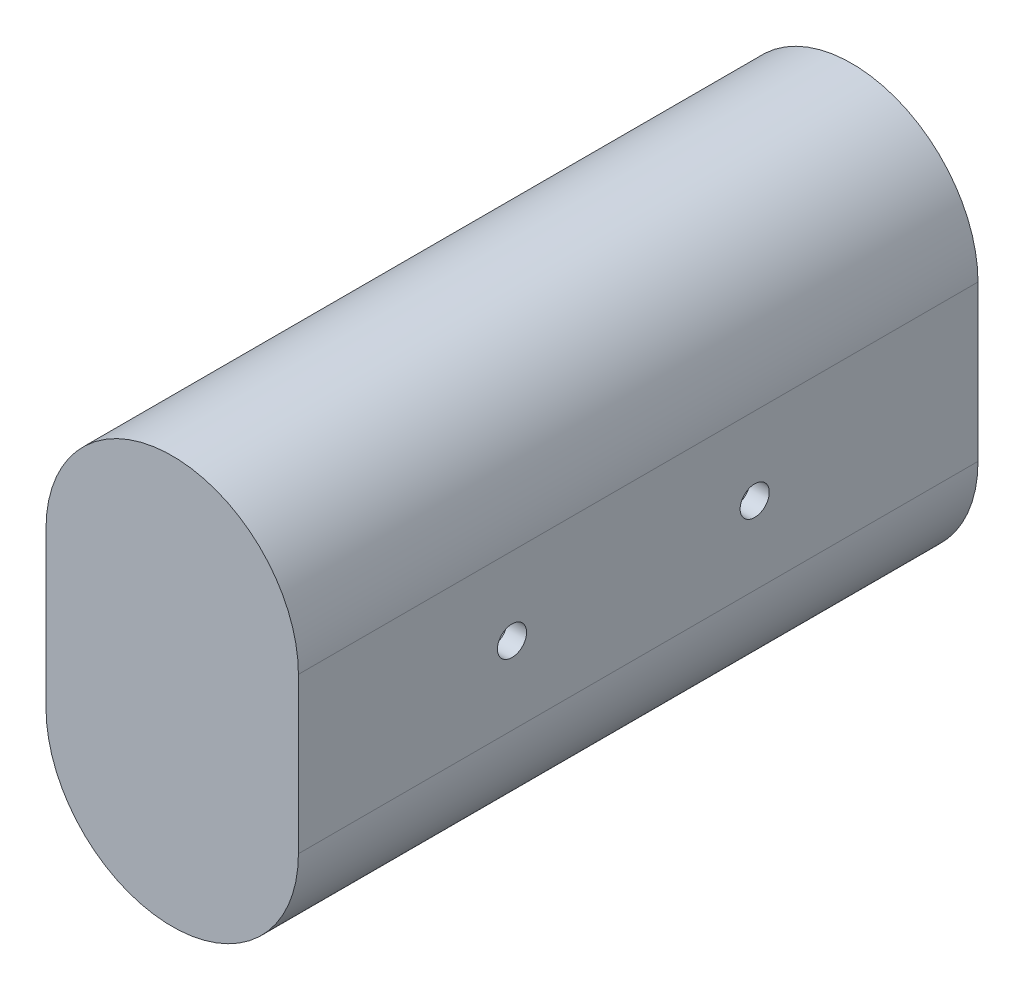
ISO-10303-21;
HEADER;
FILE_DESCRIPTION(('STEP AP214'),'2;1');
FILE_NAME('part.step','',(''),(''),'','','');
FILE_SCHEMA(('AUTOMOTIVE_DESIGN { 1 0 10303 214 1 1 1 1 }'));
ENDSEC;
DATA;
#1=APPLICATION_CONTEXT('core data for automotive mechanical design processes');
#2=APPLICATION_PROTOCOL_DEFINITION('international standard','automotive_design',2000,#1);
#3=PRODUCT_CONTEXT('',#1,'mechanical');
#4=PRODUCT('Part','Part','',(#3));
#5=PRODUCT_RELATED_PRODUCT_CATEGORY('part','',(#4));
#6=PRODUCT_DEFINITION_FORMATION('','',#4);
#7=PRODUCT_DEFINITION_CONTEXT('part definition',#1,'design');
#8=PRODUCT_DEFINITION('design','',#6,#7);
#9=PRODUCT_DEFINITION_SHAPE('','',#8);
#10=(LENGTH_UNIT() NAMED_UNIT(*) SI_UNIT(.MILLI.,.METRE.));
#11=(NAMED_UNIT(*) PLANE_ANGLE_UNIT() SI_UNIT($,.RADIAN.));
#12=(NAMED_UNIT(*) SI_UNIT($,.STERADIAN.) SOLID_ANGLE_UNIT());
#13=UNCERTAINTY_MEASURE_WITH_UNIT(LENGTH_MEASURE(1.E-05),#10,'distance_accuracy_value','');
#14=(GEOMETRIC_REPRESENTATION_CONTEXT(3) GLOBAL_UNCERTAINTY_ASSIGNED_CONTEXT((#13)) GLOBAL_UNIT_ASSIGNED_CONTEXT((#10,
#11,#12)) REPRESENTATION_CONTEXT('',''));
#15=CARTESIAN_POINT('',(0.,0.,0.));
#16=DIRECTION('',(0.,0.,1.));
#17=DIRECTION('',(1.,0.,0.));
#18=AXIS2_PLACEMENT_3D('',#15,#16,#17);
#19=CARTESIAN_POINT('',(13.,0.,70.));
#20=DIRECTION('',(0.,0.,-1.));
#21=DIRECTION('',(-1.,0.,0.));
#22=AXIS2_PLACEMENT_3D('',#19,#20,#21);
#23=CYLINDRICAL_SURFACE('',#22,11.);
#24=DIRECTION('',(0.,0.,-1.));
#25=VECTOR('',#24,1.);
#26=CARTESIAN_POINT('',(2.,0.,70.));
#27=LINE('',#26,#25);
#28=CARTESIAN_POINT('',(2.,0.,68.));
#29=VERTEX_POINT('',#28);
#30=CARTESIAN_POINT('',(2.,0.,0.));
#31=VERTEX_POINT('',#30);
#32=EDGE_CURVE('E145',#29,#31,#27,.T.);
#33=ORIENTED_EDGE('',*,*,#32,.F.);
#34=CARTESIAN_POINT('',(13.,0.,68.));
#35=DIRECTION('',(0.,0.,1.));
#36=DIRECTION('',(1.,0.,0.));
#37=AXIS2_PLACEMENT_3D('',#34,#35,#36);
#38=CIRCLE('',#37,11.);
#39=CARTESIAN_POINT('',(24.,0.,68.));
#40=VERTEX_POINT('',#39);
#41=EDGE_CURVE('E54',#29,#40,#38,.T.);
#42=ORIENTED_EDGE('',*,*,#41,.T.);
#43=DIRECTION('',(0.,0.,-1.));
#44=VECTOR('',#43,1.);
#45=CARTESIAN_POINT('',(24.,0.,70.));
#46=LINE('',#45,#44);
#47=CARTESIAN_POINT('',(24.,0.,0.));
#48=VERTEX_POINT('',#47);
#49=EDGE_CURVE('E147',#40,#48,#46,.T.);
#50=ORIENTED_EDGE('',*,*,#49,.T.);
#51=CARTESIAN_POINT('',(13.,0.,0.));
#52=DIRECTION('',(0.,0.,1.));
#53=DIRECTION('',(-1.,0.,0.));
#54=AXIS2_PLACEMENT_3D('',#51,#52,#53);
#55=CIRCLE('',#54,11.);
#56=EDGE_CURVE('E393',#31,#48,#55,.T.);
#57=ORIENTED_EDGE('',*,*,#56,.F.);
#58=EDGE_LOOP('',(#33,#42,#50,#57));
#59=FACE_BOUND('',#58,.T.);
#60=ADVANCED_FACE('F39',(#59),#23,.F.);
#61=CARTESIAN_POINT('',(24.,0.,70.));
#62=DIRECTION('',(-1.,0.,0.));
#63=DIRECTION('',(0.,0.,1.));
#64=AXIS2_PLACEMENT_3D('',#61,#62,#63);
#65=PLANE('',#64);
#66=CARTESIAN_POINT('',(24.,8.,23.));
#67=DIRECTION('',(-1.,0.,0.));
#68=DIRECTION('',(0.,0.,1.));
#69=AXIS2_PLACEMENT_3D('',#66,#67,#68);
#70=CIRCLE('',#69,1.5);
#71=CARTESIAN_POINT('',(24.,8.,24.5));
#72=VERTEX_POINT('',#71);
#73=EDGE_CURVE('E386',#72,#72,#70,.T.);
#74=ORIENTED_EDGE('',*,*,#73,.F.);
#75=EDGE_LOOP('',(#74));
#76=FACE_BOUND('',#75,.T.);
#77=CARTESIAN_POINT('',(24.,8.,48.));
#78=DIRECTION('',(-1.,0.,0.));
#79=DIRECTION('',(0.,0.,1.));
#80=AXIS2_PLACEMENT_3D('',#77,#78,#79);
#81=CIRCLE('',#80,1.5);
#82=CARTESIAN_POINT('',(24.,8.,49.5));
#83=VERTEX_POINT('',#82);
#84=EDGE_CURVE('E390',#83,#83,#81,.T.);
#85=ORIENTED_EDGE('',*,*,#84,.F.);
#86=EDGE_LOOP('',(#85));
#87=FACE_BOUND('',#86,.T.);
#88=ORIENTED_EDGE('',*,*,#49,.F.);
#89=DIRECTION('',(0.,1.,0.));
#90=VECTOR('',#89,1.);
#91=CARTESIAN_POINT('',(24.,0.,68.));
#92=LINE('',#91,#90);
#93=CARTESIAN_POINT('',(24.,16.,68.));
#94=VERTEX_POINT('',#93);
#95=EDGE_CURVE('E139',#40,#94,#92,.T.);
#96=ORIENTED_EDGE('',*,*,#95,.T.);
#97=DIRECTION('',(0.,0.,-1.));
#98=VECTOR('',#97,1.);
#99=CARTESIAN_POINT('',(24.,16.,70.));
#100=LINE('',#99,#98);
#101=CARTESIAN_POINT('',(24.,16.,0.));
#102=VERTEX_POINT('',#101);
#103=EDGE_CURVE('E138',#94,#102,#100,.T.);
#104=ORIENTED_EDGE('',*,*,#103,.T.);
#105=DIRECTION('',(0.,1.,0.));
#106=VECTOR('',#105,1.);
#107=CARTESIAN_POINT('',(24.,0.,0.));
#108=LINE('',#107,#106);
#109=EDGE_CURVE('E400',#48,#102,#108,.T.);
#110=ORIENTED_EDGE('',*,*,#109,.F.);
#111=EDGE_LOOP('',(#88,#96,#104,#110));
#112=FACE_BOUND('',#111,.T.);
#113=ADVANCED_FACE('F216',(#76,#87,#112),#65,.T.);
#114=CARTESIAN_POINT('',(13.,16.,70.));
#115=DIRECTION('',(0.,0.,-1.));
#116=DIRECTION('',(-1.,0.,0.));
#117=AXIS2_PLACEMENT_3D('',#114,#115,#116);
#118=CYLINDRICAL_SURFACE('',#117,11.);
#119=ORIENTED_EDGE('',*,*,#103,.F.);
#120=CARTESIAN_POINT('',(13.,16.,68.));
#121=DIRECTION('',(0.,0.,1.));
#122=DIRECTION('',(1.,0.,0.));
#123=AXIS2_PLACEMENT_3D('',#120,#121,#122);
#124=CIRCLE('',#123,11.);
#125=CARTESIAN_POINT('',(2.,16.,68.));
#126=VERTEX_POINT('',#125);
#127=EDGE_CURVE('E127',#94,#126,#124,.T.);
#128=ORIENTED_EDGE('',*,*,#127,.T.);
#129=DIRECTION('',(0.,0.,-1.));
#130=VECTOR('',#129,1.);
#131=CARTESIAN_POINT('',(2.,16.,70.));
#132=LINE('',#131,#130);
#133=CARTESIAN_POINT('',(2.,16.,0.));
#134=VERTEX_POINT('',#133);
#135=EDGE_CURVE('E136',#126,#134,#132,.T.);
#136=ORIENTED_EDGE('',*,*,#135,.T.);
#137=CARTESIAN_POINT('',(13.,16.,0.));
#138=DIRECTION('',(0.,0.,1.));
#139=DIRECTION('',(-1.,0.,0.));
#140=AXIS2_PLACEMENT_3D('',#137,#138,#139);
#141=CIRCLE('',#140,11.);
#142=EDGE_CURVE('E403',#102,#134,#141,.T.);
#143=ORIENTED_EDGE('',*,*,#142,.F.);
#144=EDGE_LOOP('',(#119,#128,#136,#143));
#145=FACE_BOUND('',#144,.T.);
#146=ADVANCED_FACE('F134',(#145),#118,.F.);
#147=CARTESIAN_POINT('',(2.,0.,70.));
#148=DIRECTION('',(1.,0.,0.));
#149=DIRECTION('',(0.,0.,-1.));
#150=AXIS2_PLACEMENT_3D('',#147,#148,#149);
#151=PLANE('',#150);
#152=DIRECTION('',(0.,0.,1.));
#153=VECTOR('',#152,1.);
#154=CARTESIAN_POINT('',(2.,3.,18.));
#155=LINE('',#154,#153);
#156=CARTESIAN_POINT('',(2.,3.,18.));
#157=VERTEX_POINT('',#156);
#158=CARTESIAN_POINT('',(2.,3.,48.));
#159=VERTEX_POINT('',#158);
#160=EDGE_CURVE('E380',#157,#159,#155,.T.);
#161=ORIENTED_EDGE('',*,*,#160,.T.);
#162=CARTESIAN_POINT('',(2.,8.,48.));
#163=DIRECTION('',(1.,0.,0.));
#164=DIRECTION('',(0.,0.,-1.));
#165=AXIS2_PLACEMENT_3D('',#162,#163,#164);
#166=CIRCLE('',#165,5.);
#167=CARTESIAN_POINT('',(2.,13.,48.));
#168=VERTEX_POINT('',#167);
#169=EDGE_CURVE('E409',#159,#168,#166,.F.);
#170=ORIENTED_EDGE('',*,*,#169,.T.);
#171=DIRECTION('',(0.,0.,-1.));
#172=VECTOR('',#171,1.);
#173=CARTESIAN_POINT('',(2.,13.,18.));
#174=LINE('',#173,#172);
#175=CARTESIAN_POINT('',(2.,13.,18.));
#176=VERTEX_POINT('',#175);
#177=EDGE_CURVE('E360',#168,#176,#174,.T.);
#178=ORIENTED_EDGE('',*,*,#177,.T.);
#179=CARTESIAN_POINT('',(2.,8.,18.));
#180=DIRECTION('',(1.,0.,0.));
#181=DIRECTION('',(0.,0.,-1.));
#182=AXIS2_PLACEMENT_3D('',#179,#180,#181);
#183=CIRCLE('',#182,5.);
#184=EDGE_CURVE('E414',#176,#157,#183,.F.);
#185=ORIENTED_EDGE('',*,*,#184,.T.);
#186=EDGE_LOOP('',(#161,#170,#178,#185));
#187=FACE_BOUND('',#186,.T.);
#188=ORIENTED_EDGE('',*,*,#135,.F.);
#189=DIRECTION('',(0.,-1.,0.));
#190=VECTOR('',#189,1.);
#191=CARTESIAN_POINT('',(2.,0.,68.));
#192=LINE('',#191,#190);
#193=EDGE_CURVE('E11',#126,#29,#192,.T.);
#194=ORIENTED_EDGE('',*,*,#193,.T.);
#195=ORIENTED_EDGE('',*,*,#32,.T.);
#196=DIRECTION('',(0.,-1.,0.));
#197=VECTOR('',#196,1.);
#198=CARTESIAN_POINT('',(2.,0.,0.));
#199=LINE('',#198,#197);
#200=EDGE_CURVE('E143',#134,#31,#199,.T.);
#201=ORIENTED_EDGE('',*,*,#200,.F.);
#202=EDGE_LOOP('',(#188,#194,#195,#201));
#203=FACE_BOUND('',#202,.T.);
#204=ADVANCED_FACE('F141',(#187,#203),#151,.T.);
#205=CARTESIAN_POINT('',(13.,0.,70.));
#206=DIRECTION('',(0.,0.,-1.));
#207=DIRECTION('',(-1.,0.,0.));
#208=AXIS2_PLACEMENT_3D('',#205,#206,#207);
#209=PLANE('',#208);
#210=CARTESIAN_POINT('',(13.,0.,70.));
#211=DIRECTION('',(0.,0.,1.));
#212=DIRECTION('',(-1.,0.,0.));
#213=AXIS2_PLACEMENT_3D('',#210,#211,#212);
#214=CIRCLE('',#213,13.);
#215=CARTESIAN_POINT('',(0.,0.,70.));
#216=VERTEX_POINT('',#215);
#217=CARTESIAN_POINT('',(26.,0.,70.));
#218=VERTEX_POINT('',#217);
#219=EDGE_CURVE('E154',#216,#218,#214,.T.);
#220=ORIENTED_EDGE('',*,*,#219,.T.);
#221=DIRECTION('',(0.,1.,0.));
#222=VECTOR('',#221,1.);
#223=CARTESIAN_POINT('',(26.,0.,70.));
#224=LINE('',#223,#222);
#225=CARTESIAN_POINT('',(26.,16.,70.));
#226=VERTEX_POINT('',#225);
#227=EDGE_CURVE('E157',#218,#226,#224,.T.);
#228=ORIENTED_EDGE('',*,*,#227,.T.);
#229=CARTESIAN_POINT('',(13.,16.,70.));
#230=DIRECTION('',(0.,0.,1.));
#231=DIRECTION('',(-1.,0.,0.));
#232=AXIS2_PLACEMENT_3D('',#229,#230,#231);
#233=CIRCLE('',#232,13.);
#234=CARTESIAN_POINT('',(0.,16.,70.));
#235=VERTEX_POINT('',#234);
#236=EDGE_CURVE('E160',#226,#235,#233,.T.);
#237=ORIENTED_EDGE('',*,*,#236,.T.);
#238=DIRECTION('',(0.,-1.,0.));
#239=VECTOR('',#238,1.);
#240=CARTESIAN_POINT('',(0.,0.,70.));
#241=LINE('',#240,#239);
#242=EDGE_CURVE('E162',#235,#216,#241,.T.);
#243=ORIENTED_EDGE('',*,*,#242,.T.);
#244=EDGE_LOOP('',(#220,#228,#237,#243));
#245=FACE_BOUND('',#244,.T.);
#246=ADVANCED_FACE('F203',(#245),#209,.F.);
#247=CARTESIAN_POINT('',(13.,0.,0.));
#248=DIRECTION('',(0.,0.,-1.));
#249=DIRECTION('',(-1.,0.,0.));
#250=AXIS2_PLACEMENT_3D('',#247,#248,#249);
#251=PLANE('',#250);
#252=CARTESIAN_POINT('',(13.,0.,0.));
#253=DIRECTION('',(0.,0.,1.));
#254=DIRECTION('',(-1.,0.,0.));
#255=AXIS2_PLACEMENT_3D('',#252,#253,#254);
#256=CIRCLE('',#255,13.);
#257=CARTESIAN_POINT('',(0.,0.,0.));
#258=VERTEX_POINT('',#257);
#259=CARTESIAN_POINT('',(26.,0.,0.));
#260=VERTEX_POINT('',#259);
#261=EDGE_CURVE('E153',#258,#260,#256,.T.);
#262=ORIENTED_EDGE('',*,*,#261,.F.);
#263=DIRECTION('',(0.,-1.,0.));
#264=VECTOR('',#263,1.);
#265=CARTESIAN_POINT('',(0.,0.,0.));
#266=LINE('',#265,#264);
#267=CARTESIAN_POINT('',(0.,16.,0.));
#268=VERTEX_POINT('',#267);
#269=EDGE_CURVE('E158',#268,#258,#266,.T.);
#270=ORIENTED_EDGE('',*,*,#269,.F.);
#271=CARTESIAN_POINT('',(13.,16.,0.));
#272=DIRECTION('',(0.,0.,1.));
#273=DIRECTION('',(-1.,0.,0.));
#274=AXIS2_PLACEMENT_3D('',#271,#272,#273);
#275=CIRCLE('',#274,13.);
#276=CARTESIAN_POINT('',(26.,16.,0.));
#277=VERTEX_POINT('',#276);
#278=EDGE_CURVE('E170',#277,#268,#275,.T.);
#279=ORIENTED_EDGE('',*,*,#278,.F.);
#280=DIRECTION('',(0.,1.,0.));
#281=VECTOR('',#280,1.);
#282=CARTESIAN_POINT('',(26.,0.,0.));
#283=LINE('',#282,#281);
#284=EDGE_CURVE('E167',#260,#277,#283,.T.);
#285=ORIENTED_EDGE('',*,*,#284,.F.);
#286=EDGE_LOOP('',(#262,#270,#279,#285));
#287=FACE_BOUND('',#286,.T.);
#288=ORIENTED_EDGE('',*,*,#200,.T.);
#289=ORIENTED_EDGE('',*,*,#56,.T.);
#290=ORIENTED_EDGE('',*,*,#109,.T.);
#291=ORIENTED_EDGE('',*,*,#142,.T.);
#292=EDGE_LOOP('',(#288,#289,#290,#291));
#293=FACE_BOUND('',#292,.T.);
#294=ADVANCED_FACE('F190',(#287,#293),#251,.T.);
#295=CARTESIAN_POINT('',(13.,0.,70.));
#296=DIRECTION('',(0.,0.,-1.));
#297=DIRECTION('',(-1.,0.,0.));
#298=AXIS2_PLACEMENT_3D('',#295,#296,#297);
#299=CYLINDRICAL_SURFACE('',#298,13.);
#300=DIRECTION('',(0.,0.,-1.));
#301=VECTOR('',#300,1.);
#302=CARTESIAN_POINT('',(0.,0.,70.));
#303=LINE('',#302,#301);
#304=EDGE_CURVE('E164',#216,#258,#303,.T.);
#305=ORIENTED_EDGE('',*,*,#304,.T.);
#306=ORIENTED_EDGE('',*,*,#261,.T.);
#307=DIRECTION('',(0.,0.,-1.));
#308=VECTOR('',#307,1.);
#309=CARTESIAN_POINT('',(26.,0.,70.));
#310=LINE('',#309,#308);
#311=EDGE_CURVE('E47',#218,#260,#310,.T.);
#312=ORIENTED_EDGE('',*,*,#311,.F.);
#313=ORIENTED_EDGE('',*,*,#219,.F.);
#314=EDGE_LOOP('',(#305,#306,#312,#313));
#315=FACE_BOUND('',#314,.T.);
#316=ADVANCED_FACE('F41',(#315),#299,.T.);
#317=CARTESIAN_POINT('',(26.,0.,70.));
#318=DIRECTION('',(-1.,0.,0.));
#319=DIRECTION('',(0.,0.,1.));
#320=AXIS2_PLACEMENT_3D('',#317,#318,#319);
#321=PLANE('',#320);
#322=ORIENTED_EDGE('',*,*,#311,.T.);
#323=ORIENTED_EDGE('',*,*,#284,.T.);
#324=DIRECTION('',(0.,0.,-1.));
#325=VECTOR('',#324,1.);
#326=CARTESIAN_POINT('',(26.,16.,70.));
#327=LINE('',#326,#325);
#328=EDGE_CURVE('E178',#226,#277,#327,.T.);
#329=ORIENTED_EDGE('',*,*,#328,.F.);
#330=ORIENTED_EDGE('',*,*,#227,.F.);
#331=EDGE_LOOP('',(#322,#323,#329,#330));
#332=FACE_BOUND('',#331,.T.);
#333=CARTESIAN_POINT('',(26.,8.,48.));
#334=DIRECTION('',(-1.,0.,0.));
#335=DIRECTION('',(0.,0.,1.));
#336=AXIS2_PLACEMENT_3D('',#333,#334,#335);
#337=CIRCLE('',#336,1.5);
#338=CARTESIAN_POINT('',(26.,8.,49.5));
#339=VERTEX_POINT('',#338);
#340=EDGE_CURVE('E385',#339,#339,#337,.F.);
#341=ORIENTED_EDGE('',*,*,#340,.F.);
#342=EDGE_LOOP('',(#341));
#343=FACE_BOUND('',#342,.T.);
#344=CARTESIAN_POINT('',(26.,8.,23.));
#345=DIRECTION('',(-1.,0.,0.));
#346=DIRECTION('',(0.,0.,1.));
#347=AXIS2_PLACEMENT_3D('',#344,#345,#346);
#348=CIRCLE('',#347,1.5);
#349=CARTESIAN_POINT('',(26.,8.,24.5));
#350=VERTEX_POINT('',#349);
#351=EDGE_CURVE('E389',#350,#350,#348,.F.);
#352=ORIENTED_EDGE('',*,*,#351,.F.);
#353=EDGE_LOOP('',(#352));
#354=FACE_BOUND('',#353,.T.);
#355=ADVANCED_FACE('F182',(#332,#343,#354),#321,.F.);
#356=CARTESIAN_POINT('',(13.,16.,70.));
#357=DIRECTION('',(0.,0.,-1.));
#358=DIRECTION('',(-1.,0.,0.));
#359=AXIS2_PLACEMENT_3D('',#356,#357,#358);
#360=CYLINDRICAL_SURFACE('',#359,13.);
#361=ORIENTED_EDGE('',*,*,#328,.T.);
#362=ORIENTED_EDGE('',*,*,#278,.T.);
#363=DIRECTION('',(0.,0.,-1.));
#364=VECTOR('',#363,1.);
#365=CARTESIAN_POINT('',(0.,16.,70.));
#366=LINE('',#365,#364);
#367=EDGE_CURVE('E176',#235,#268,#366,.T.);
#368=ORIENTED_EDGE('',*,*,#367,.F.);
#369=ORIENTED_EDGE('',*,*,#236,.F.);
#370=EDGE_LOOP('',(#361,#362,#368,#369));
#371=FACE_BOUND('',#370,.T.);
#372=ADVANCED_FACE('F201',(#371),#360,.T.);
#373=CARTESIAN_POINT('',(0.,0.,70.));
#374=DIRECTION('',(1.,0.,0.));
#375=DIRECTION('',(0.,1.,0.));
#376=AXIS2_PLACEMENT_3D('',#373,#374,#375);
#377=PLANE('',#376);
#378=ORIENTED_EDGE('',*,*,#367,.T.);
#379=ORIENTED_EDGE('',*,*,#269,.T.);
#380=ORIENTED_EDGE('',*,*,#304,.F.);
#381=ORIENTED_EDGE('',*,*,#242,.F.);
#382=EDGE_LOOP('',(#378,#379,#380,#381));
#383=FACE_BOUND('',#382,.T.);
#384=CARTESIAN_POINT('',(0.,8.,48.));
#385=DIRECTION('',(-1.,0.,0.));
#386=DIRECTION('',(0.,-1.,0.));
#387=AXIS2_PLACEMENT_3D('',#384,#385,#386);
#388=CIRCLE('',#387,5.);
#389=CARTESIAN_POINT('',(0.,3.,48.));
#390=VERTEX_POINT('',#389);
#391=CARTESIAN_POINT('',(0.,13.,48.));
#392=VERTEX_POINT('',#391);
#393=EDGE_CURVE('E366',#390,#392,#388,.T.);
#394=ORIENTED_EDGE('',*,*,#393,.F.);
#395=DIRECTION('',(0.,0.,1.));
#396=VECTOR('',#395,1.);
#397=CARTESIAN_POINT('',(0.,3.,18.));
#398=LINE('',#397,#396);
#399=CARTESIAN_POINT('',(0.,3.,18.));
#400=VERTEX_POINT('',#399);
#401=EDGE_CURVE('E370',#400,#390,#398,.T.);
#402=ORIENTED_EDGE('',*,*,#401,.F.);
#403=CARTESIAN_POINT('',(0.,8.,18.));
#404=DIRECTION('',(-1.,0.,0.));
#405=DIRECTION('',(0.,-1.,0.));
#406=AXIS2_PLACEMENT_3D('',#403,#404,#405);
#407=CIRCLE('',#406,5.);
#408=CARTESIAN_POINT('',(0.,13.,18.));
#409=VERTEX_POINT('',#408);
#410=EDGE_CURVE('E374',#409,#400,#407,.T.);
#411=ORIENTED_EDGE('',*,*,#410,.F.);
#412=DIRECTION('',(0.,0.,-1.));
#413=VECTOR('',#412,1.);
#414=CARTESIAN_POINT('',(0.,13.,18.));
#415=LINE('',#414,#413);
#416=EDGE_CURVE('E61',#392,#409,#415,.T.);
#417=ORIENTED_EDGE('',*,*,#416,.F.);
#418=EDGE_LOOP('',(#394,#402,#411,#417));
#419=FACE_BOUND('',#418,.T.);
#420=ADVANCED_FACE('F196',(#383,#419),#377,.F.);
#421=CARTESIAN_POINT('',(26.001,8.,48.));
#422=DIRECTION('',(-1.,0.,0.));
#423=DIRECTION('',(0.,0.,1.));
#424=AXIS2_PLACEMENT_3D('',#421,#422,#423);
#425=CYLINDRICAL_SURFACE('',#424,1.5);
#426=ORIENTED_EDGE('',*,*,#84,.T.);
#427=EDGE_LOOP('',(#426));
#428=FACE_BOUND('',#427,.T.);
#429=ORIENTED_EDGE('',*,*,#340,.T.);
#430=EDGE_LOOP('',(#429));
#431=FACE_BOUND('',#430,.T.);
#432=ADVANCED_FACE('F227',(#428,#431),#425,.F.);
#433=CARTESIAN_POINT('',(26.001,8.,23.));
#434=DIRECTION('',(-1.,0.,0.));
#435=DIRECTION('',(0.,0.,1.));
#436=AXIS2_PLACEMENT_3D('',#433,#434,#435);
#437=CYLINDRICAL_SURFACE('',#436,1.5);
#438=ORIENTED_EDGE('',*,*,#73,.T.);
#439=EDGE_LOOP('',(#438));
#440=FACE_BOUND('',#439,.T.);
#441=ORIENTED_EDGE('',*,*,#351,.T.);
#442=EDGE_LOOP('',(#441));
#443=FACE_BOUND('',#442,.T.);
#444=ADVANCED_FACE('F230',(#440,#443),#437,.F.);
#445=CARTESIAN_POINT('',(26.001,3.,18.));
#446=DIRECTION('',(0.,-1.,0.));
#447=DIRECTION('',(1.,0.,0.));
#448=AXIS2_PLACEMENT_3D('',#445,#446,#447);
#449=PLANE('',#448);
#450=DIRECTION('',(-1.,0.,0.));
#451=VECTOR('',#450,1.);
#452=CARTESIAN_POINT('',(26.001,3.,18.));
#453=LINE('',#452,#451);
#454=EDGE_CURVE('E375',#157,#400,#453,.T.);
#455=ORIENTED_EDGE('',*,*,#454,.T.);
#456=ORIENTED_EDGE('',*,*,#401,.T.);
#457=DIRECTION('',(-1.,0.,0.));
#458=VECTOR('',#457,1.);
#459=CARTESIAN_POINT('',(26.001,3.,48.));
#460=LINE('',#459,#458);
#461=EDGE_CURVE('E363',#159,#390,#460,.T.);
#462=ORIENTED_EDGE('',*,*,#461,.F.);
#463=ORIENTED_EDGE('',*,*,#160,.F.);
#464=EDGE_LOOP('',(#455,#456,#462,#463));
#465=FACE_BOUND('',#464,.T.);
#466=ADVANCED_FACE('F234',(#465),#449,.F.);
#467=CARTESIAN_POINT('',(26.001,8.,48.));
#468=DIRECTION('',(-1.,0.,0.));
#469=DIRECTION('',(0.,-1.,0.));
#470=AXIS2_PLACEMENT_3D('',#467,#468,#469);
#471=CYLINDRICAL_SURFACE('',#470,5.);
#472=ORIENTED_EDGE('',*,*,#461,.T.);
#473=ORIENTED_EDGE('',*,*,#393,.T.);
#474=DIRECTION('',(-1.,0.,0.));
#475=VECTOR('',#474,1.);
#476=CARTESIAN_POINT('',(26.001,13.,48.));
#477=LINE('',#476,#475);
#478=EDGE_CURVE('E357',#168,#392,#477,.T.);
#479=ORIENTED_EDGE('',*,*,#478,.F.);
#480=ORIENTED_EDGE('',*,*,#169,.F.);
#481=EDGE_LOOP('',(#472,#473,#479,#480));
#482=FACE_BOUND('',#481,.T.);
#483=ADVANCED_FACE('F242',(#482),#471,.F.);
#484=CARTESIAN_POINT('',(26.001,13.,18.));
#485=DIRECTION('',(0.,1.,0.));
#486=DIRECTION('',(-1.,0.,0.));
#487=AXIS2_PLACEMENT_3D('',#484,#485,#486);
#488=PLANE('',#487);
#489=ORIENTED_EDGE('',*,*,#478,.T.);
#490=ORIENTED_EDGE('',*,*,#416,.T.);
#491=DIRECTION('',(-1.,0.,0.));
#492=VECTOR('',#491,1.);
#493=CARTESIAN_POINT('',(26.001,13.,18.));
#494=LINE('',#493,#492);
#495=EDGE_CURVE('E362',#176,#409,#494,.T.);
#496=ORIENTED_EDGE('',*,*,#495,.F.);
#497=ORIENTED_EDGE('',*,*,#177,.F.);
#498=EDGE_LOOP('',(#489,#490,#496,#497));
#499=FACE_BOUND('',#498,.T.);
#500=ADVANCED_FACE('F238',(#499),#488,.F.);
#501=CARTESIAN_POINT('',(26.001,8.,18.));
#502=DIRECTION('',(-1.,0.,0.));
#503=DIRECTION('',(0.,-1.,0.));
#504=AXIS2_PLACEMENT_3D('',#501,#502,#503);
#505=CYLINDRICAL_SURFACE('',#504,5.);
#506=ORIENTED_EDGE('',*,*,#495,.T.);
#507=ORIENTED_EDGE('',*,*,#410,.T.);
#508=ORIENTED_EDGE('',*,*,#454,.F.);
#509=ORIENTED_EDGE('',*,*,#184,.F.);
#510=EDGE_LOOP('',(#506,#507,#508,#509));
#511=FACE_BOUND('',#510,.T.);
#512=ADVANCED_FACE('F236',(#511),#505,.F.);
#513=CARTESIAN_POINT('',(13.,0.,68.));
#514=DIRECTION('',(0.,0.,1.));
#515=DIRECTION('',(1.,0.,0.));
#516=AXIS2_PLACEMENT_3D('',#513,#514,#515);
#517=PLANE('',#516);
#518=ORIENTED_EDGE('',*,*,#41,.F.);
#519=ORIENTED_EDGE('',*,*,#193,.F.);
#520=ORIENTED_EDGE('',*,*,#127,.F.);
#521=ORIENTED_EDGE('',*,*,#95,.F.);
#522=EDGE_LOOP('',(#518,#519,#520,#521));
#523=FACE_BOUND('',#522,.T.);
#524=ADVANCED_FACE('F126',(#523),#517,.F.);
#525=CLOSED_SHELL('',(#60,#113,#146,#204,#246,#294,#316,#355,#372,#420,#432,#444,#466,#483,#500,
#512,#524));
#526=MANIFOLD_SOLID_BREP('B2',#525);
#527=ADVANCED_BREP_SHAPE_REPRESENTATION('',(#18,#526),#14);
#528=SHAPE_DEFINITION_REPRESENTATION(#9,#527);
ENDSEC;
END-ISO-10303-21;
